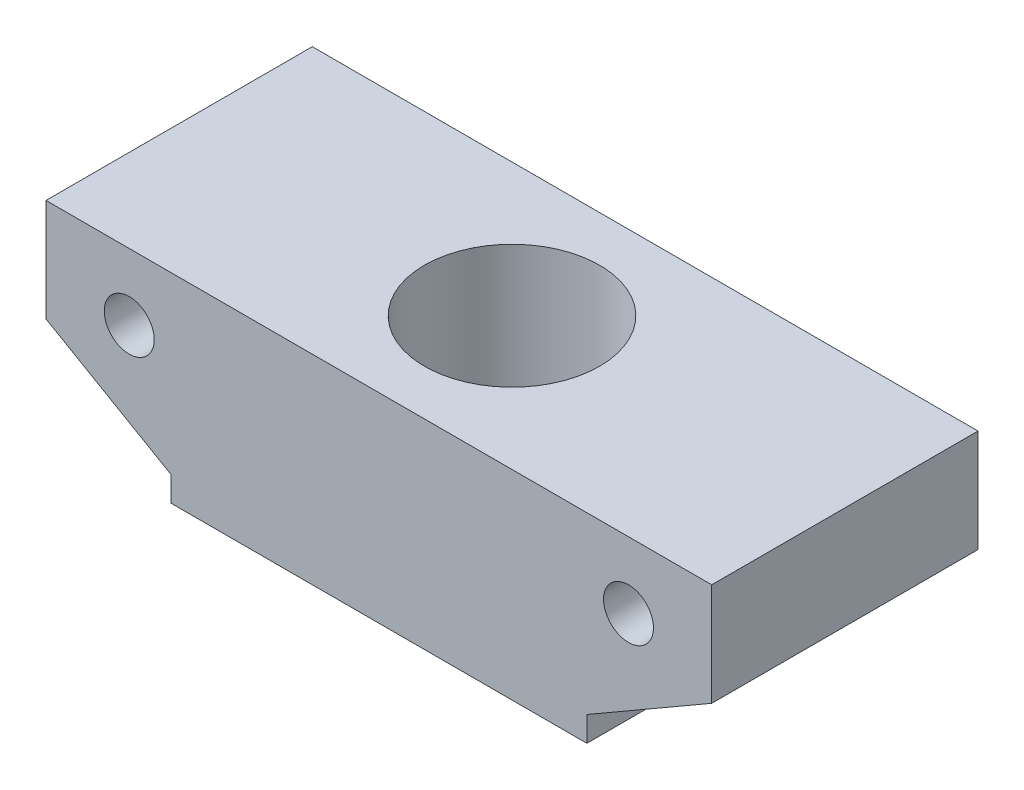
ISO-10303-21;
HEADER;
FILE_DESCRIPTION(('STEP AP214'),'2;1');
FILE_NAME('part.step','',(''),(''),'','','');
FILE_SCHEMA(('AUTOMOTIVE_DESIGN { 1 0 10303 214 1 1 1 1 }'));
ENDSEC;
DATA;
#1=APPLICATION_CONTEXT('core data for automotive mechanical design processes');
#2=APPLICATION_PROTOCOL_DEFINITION('international standard','automotive_design',2000,#1);
#3=PRODUCT_CONTEXT('',#1,'mechanical');
#4=PRODUCT('Part','Part','',(#3));
#5=PRODUCT_RELATED_PRODUCT_CATEGORY('part','',(#4));
#6=PRODUCT_DEFINITION_FORMATION('','',#4);
#7=PRODUCT_DEFINITION_CONTEXT('part definition',#1,'design');
#8=PRODUCT_DEFINITION('design','',#6,#7);
#9=PRODUCT_DEFINITION_SHAPE('','',#8);
#10=(LENGTH_UNIT() NAMED_UNIT(*) SI_UNIT(.MILLI.,.METRE.));
#11=(NAMED_UNIT(*) PLANE_ANGLE_UNIT() SI_UNIT($,.RADIAN.));
#12=(NAMED_UNIT(*) SI_UNIT($,.STERADIAN.) SOLID_ANGLE_UNIT());
#13=UNCERTAINTY_MEASURE_WITH_UNIT(LENGTH_MEASURE(1.E-05),#10,'distance_accuracy_value','');
#14=(GEOMETRIC_REPRESENTATION_CONTEXT(3) GLOBAL_UNCERTAINTY_ASSIGNED_CONTEXT((#13)) GLOBAL_UNIT_ASSIGNED_CONTEXT((#10,
#11,#12)) REPRESENTATION_CONTEXT('',''));
#15=CARTESIAN_POINT('',(0.,0.,0.));
#16=DIRECTION('',(0.,0.,1.));
#17=DIRECTION('',(1.,0.,0.));
#18=AXIS2_PLACEMENT_3D('',#15,#16,#17);
#19=CARTESIAN_POINT('',(12.5,12.,0.));
#20=DIRECTION('',(0.,0.,1.));
#21=DIRECTION('',(1.,0.,0.));
#22=AXIS2_PLACEMENT_3D('',#19,#20,#21);
#23=PLANE('',#22);
#24=CARTESIAN_POINT('',(15.,8.,0.));
#25=DIRECTION('',(0.,0.,-1.));
#26=DIRECTION('',(-1.,0.,0.));
#27=AXIS2_PLACEMENT_3D('',#24,#25,#26);
#28=CIRCLE('',#27,1.5);
#29=CARTESIAN_POINT('',(13.5,8.,0.));
#30=VERTEX_POINT('',#29);
#31=EDGE_CURVE('E226',#30,#30,#28,.T.);
#32=ORIENTED_EDGE('',*,*,#31,.F.);
#33=EDGE_LOOP('',(#32));
#34=FACE_BOUND('',#33,.T.);
#35=DIRECTION('',(0.,1.,0.));
#36=VECTOR('',#35,1.);
#37=CARTESIAN_POINT('',(12.5,0.,0.));
#38=LINE('',#37,#36);
#39=CARTESIAN_POINT('',(12.5,0.,0.));
#40=VERTEX_POINT('',#39);
#41=CARTESIAN_POINT('',(12.5,1.5,0.));
#42=VERTEX_POINT('',#41);
#43=EDGE_CURVE('E106',#40,#42,#38,.T.);
#44=ORIENTED_EDGE('',*,*,#43,.F.);
#45=DIRECTION('',(1.,0.,0.));
#46=VECTOR('',#45,1.);
#47=CARTESIAN_POINT('',(-12.5,0.,0.));
#48=LINE('',#47,#46);
#49=CARTESIAN_POINT('',(-12.5,0.,0.));
#50=VERTEX_POINT('',#49);
#51=EDGE_CURVE('E140',#50,#40,#48,.T.);
#52=ORIENTED_EDGE('',*,*,#51,.F.);
#53=DIRECTION('',(0.,1.,0.));
#54=VECTOR('',#53,1.);
#55=CARTESIAN_POINT('',(-12.5,0.,0.));
#56=LINE('',#55,#54);
#57=CARTESIAN_POINT('',(-12.5,1.5,0.));
#58=VERTEX_POINT('',#57);
#59=EDGE_CURVE('E137',#50,#58,#56,.T.);
#60=ORIENTED_EDGE('',*,*,#59,.T.);
#61=DIRECTION('',(-0.866025403784441,0.499999999999995,0.));
#62=VECTOR('',#61,1.);
#63=CARTESIAN_POINT('',(-12.5,1.5,0.));
#64=LINE('',#63,#62);
#65=CARTESIAN_POINT('',(-20.,5.83012701892213,0.));
#66=VERTEX_POINT('',#65);
#67=EDGE_CURVE('E134',#58,#66,#64,.T.);
#68=ORIENTED_EDGE('',*,*,#67,.T.);
#69=DIRECTION('',(0.,1.,0.));
#70=VECTOR('',#69,1.);
#71=CARTESIAN_POINT('',(-20.,5.83012701892213,0.));
#72=LINE('',#71,#70);
#73=CARTESIAN_POINT('',(-20.,12.,0.));
#74=VERTEX_POINT('',#73);
#75=EDGE_CURVE('E131',#66,#74,#72,.T.);
#76=ORIENTED_EDGE('',*,*,#75,.T.);
#77=DIRECTION('',(-1.,0.,0.));
#78=VECTOR('',#77,1.);
#79=CARTESIAN_POINT('',(20.,12.,0.));
#80=LINE('',#79,#78);
#81=CARTESIAN_POINT('',(20.,12.,0.));
#82=VERTEX_POINT('',#81);
#83=EDGE_CURVE('E128',#82,#74,#80,.T.);
#84=ORIENTED_EDGE('',*,*,#83,.F.);
#85=DIRECTION('',(0.,1.,0.));
#86=VECTOR('',#85,1.);
#87=CARTESIAN_POINT('',(20.,5.83012701892213,0.));
#88=LINE('',#87,#86);
#89=CARTESIAN_POINT('',(20.,5.83012701892213,0.));
#90=VERTEX_POINT('',#89);
#91=EDGE_CURVE('E108',#90,#82,#88,.T.);
#92=ORIENTED_EDGE('',*,*,#91,.F.);
#93=DIRECTION('',(0.866025403784442,0.499999999999995,0.));
#94=VECTOR('',#93,1.);
#95=CARTESIAN_POINT('',(12.5,1.5,0.));
#96=LINE('',#95,#94);
#97=EDGE_CURVE('E102',#42,#90,#96,.T.);
#98=ORIENTED_EDGE('',*,*,#97,.F.);
#99=EDGE_LOOP('',(#44,#52,#60,#68,#76,#84,#92,#98));
#100=FACE_BOUND('',#99,.T.);
#101=CARTESIAN_POINT('',(-15.,8.,0.));
#102=DIRECTION('',(0.,0.,-1.));
#103=DIRECTION('',(-1.,0.,0.));
#104=AXIS2_PLACEMENT_3D('',#101,#102,#103);
#105=CIRCLE('',#104,1.5);
#106=CARTESIAN_POINT('',(-16.5,8.,0.));
#107=VERTEX_POINT('',#106);
#108=EDGE_CURVE('E222',#107,#107,#105,.T.);
#109=ORIENTED_EDGE('',*,*,#108,.F.);
#110=EDGE_LOOP('',(#109));
#111=FACE_BOUND('',#110,.T.);
#112=ADVANCED_FACE('F35',(#34,#100,#111),#23,.F.);
#113=CARTESIAN_POINT('',(12.5,12.,16.));
#114=DIRECTION('',(0.,0.,1.));
#115=DIRECTION('',(1.,0.,0.));
#116=AXIS2_PLACEMENT_3D('',#113,#114,#115);
#117=PLANE('',#116);
#118=CARTESIAN_POINT('',(15.,8.,16.));
#119=DIRECTION('',(0.,0.,-1.));
#120=DIRECTION('',(-1.,0.,0.));
#121=AXIS2_PLACEMENT_3D('',#118,#119,#120);
#122=CIRCLE('',#121,1.5);
#123=CARTESIAN_POINT('',(13.5,8.,16.));
#124=VERTEX_POINT('',#123);
#125=EDGE_CURVE('E229',#124,#124,#122,.T.);
#126=ORIENTED_EDGE('',*,*,#125,.T.);
#127=EDGE_LOOP('',(#126));
#128=FACE_BOUND('',#127,.T.);
#129=DIRECTION('',(0.,1.,0.));
#130=VECTOR('',#129,1.);
#131=CARTESIAN_POINT('',(12.5,0.,16.));
#132=LINE('',#131,#130);
#133=CARTESIAN_POINT('',(12.5,0.,16.));
#134=VERTEX_POINT('',#133);
#135=CARTESIAN_POINT('',(12.5,1.5,16.));
#136=VERTEX_POINT('',#135);
#137=EDGE_CURVE('E142',#134,#136,#132,.T.);
#138=ORIENTED_EDGE('',*,*,#137,.T.);
#139=DIRECTION('',(0.866025403784442,0.499999999999995,0.));
#140=VECTOR('',#139,1.);
#141=CARTESIAN_POINT('',(12.5,1.5,16.));
#142=LINE('',#141,#140);
#143=CARTESIAN_POINT('',(20.,5.83012701892213,16.));
#144=VERTEX_POINT('',#143);
#145=EDGE_CURVE('E115',#136,#144,#142,.T.);
#146=ORIENTED_EDGE('',*,*,#145,.T.);
#147=DIRECTION('',(0.,1.,0.));
#148=VECTOR('',#147,1.);
#149=CARTESIAN_POINT('',(20.,5.83012701892213,16.));
#150=LINE('',#149,#148);
#151=CARTESIAN_POINT('',(20.,12.,16.));
#152=VERTEX_POINT('',#151);
#153=EDGE_CURVE('E145',#144,#152,#150,.T.);
#154=ORIENTED_EDGE('',*,*,#153,.T.);
#155=DIRECTION('',(-1.,0.,0.));
#156=VECTOR('',#155,1.);
#157=CARTESIAN_POINT('',(20.,12.,16.));
#158=LINE('',#157,#156);
#159=CARTESIAN_POINT('',(-20.,12.,16.));
#160=VERTEX_POINT('',#159);
#161=EDGE_CURVE('E147',#152,#160,#158,.T.);
#162=ORIENTED_EDGE('',*,*,#161,.T.);
#163=DIRECTION('',(0.,1.,0.));
#164=VECTOR('',#163,1.);
#165=CARTESIAN_POINT('',(-20.,5.83012701892213,16.));
#166=LINE('',#165,#164);
#167=CARTESIAN_POINT('',(-20.,5.83012701892213,16.));
#168=VERTEX_POINT('',#167);
#169=EDGE_CURVE('E149',#168,#160,#166,.T.);
#170=ORIENTED_EDGE('',*,*,#169,.F.);
#171=DIRECTION('',(-0.866025403784441,0.499999999999995,0.));
#172=VECTOR('',#171,1.);
#173=CARTESIAN_POINT('',(-12.5,1.5,16.));
#174=LINE('',#173,#172);
#175=CARTESIAN_POINT('',(-12.5,1.5,16.));
#176=VERTEX_POINT('',#175);
#177=EDGE_CURVE('E152',#176,#168,#174,.T.);
#178=ORIENTED_EDGE('',*,*,#177,.F.);
#179=DIRECTION('',(0.,1.,0.));
#180=VECTOR('',#179,1.);
#181=CARTESIAN_POINT('',(-12.5,0.,16.));
#182=LINE('',#181,#180);
#183=CARTESIAN_POINT('',(-12.5,0.,16.));
#184=VERTEX_POINT('',#183);
#185=EDGE_CURVE('E155',#184,#176,#182,.T.);
#186=ORIENTED_EDGE('',*,*,#185,.F.);
#187=DIRECTION('',(1.,0.,0.));
#188=VECTOR('',#187,1.);
#189=CARTESIAN_POINT('',(-12.5,0.,16.));
#190=LINE('',#189,#188);
#191=EDGE_CURVE('E50',#184,#134,#190,.T.);
#192=ORIENTED_EDGE('',*,*,#191,.T.);
#193=EDGE_LOOP('',(#138,#146,#154,#162,#170,#178,#186,#192));
#194=FACE_BOUND('',#193,.T.);
#195=CARTESIAN_POINT('',(-15.,8.,16.));
#196=DIRECTION('',(0.,0.,-1.));
#197=DIRECTION('',(-1.,0.,0.));
#198=AXIS2_PLACEMENT_3D('',#195,#196,#197);
#199=CIRCLE('',#198,1.5);
#200=CARTESIAN_POINT('',(-16.5,8.,16.));
#201=VERTEX_POINT('',#200);
#202=EDGE_CURVE('E225',#201,#201,#199,.T.);
#203=ORIENTED_EDGE('',*,*,#202,.T.);
#204=EDGE_LOOP('',(#203));
#205=FACE_BOUND('',#204,.T.);
#206=ADVANCED_FACE('F173',(#128,#194,#205),#117,.T.);
#207=CARTESIAN_POINT('',(12.5,0.,16.));
#208=DIRECTION('',(-1.,0.,0.));
#209=DIRECTION('',(0.,-1.,0.));
#210=AXIS2_PLACEMENT_3D('',#207,#208,#209);
#211=PLANE('',#210);
#212=ORIENTED_EDGE('',*,*,#43,.T.);
#213=DIRECTION('',(0.,0.,-1.));
#214=VECTOR('',#213,1.);
#215=CARTESIAN_POINT('',(12.5,1.5,16.));
#216=LINE('',#215,#214);
#217=EDGE_CURVE('E11',#136,#42,#216,.T.);
#218=ORIENTED_EDGE('',*,*,#217,.F.);
#219=ORIENTED_EDGE('',*,*,#137,.F.);
#220=DIRECTION('',(0.,0.,-1.));
#221=VECTOR('',#220,1.);
#222=CARTESIAN_POINT('',(12.5,0.,16.));
#223=LINE('',#222,#221);
#224=EDGE_CURVE('E119',#134,#40,#223,.T.);
#225=ORIENTED_EDGE('',*,*,#224,.T.);
#226=EDGE_LOOP('',(#212,#218,#219,#225));
#227=FACE_BOUND('',#226,.T.);
#228=ADVANCED_FACE('F37',(#227),#211,.F.);
#229=CARTESIAN_POINT('',(12.5,1.5,16.));
#230=DIRECTION('',(-0.499999999999995,0.866025403784442,0.));
#231=DIRECTION('',(-0.866025403784442,-0.499999999999995,0.));
#232=AXIS2_PLACEMENT_3D('',#229,#230,#231);
#233=PLANE('',#232);
#234=ORIENTED_EDGE('',*,*,#97,.T.);
#235=DIRECTION('',(0.,0.,-1.));
#236=VECTOR('',#235,1.);
#237=CARTESIAN_POINT('',(20.,5.83012701892213,16.));
#238=LINE('',#237,#236);
#239=EDGE_CURVE('E43',#144,#90,#238,.T.);
#240=ORIENTED_EDGE('',*,*,#239,.F.);
#241=ORIENTED_EDGE('',*,*,#145,.F.);
#242=ORIENTED_EDGE('',*,*,#217,.T.);
#243=EDGE_LOOP('',(#234,#240,#241,#242));
#244=FACE_BOUND('',#243,.T.);
#245=ADVANCED_FACE('F114',(#244),#233,.F.);
#246=CARTESIAN_POINT('',(20.,5.83012701892213,16.));
#247=DIRECTION('',(-1.,0.,0.));
#248=DIRECTION('',(0.,0.,1.));
#249=AXIS2_PLACEMENT_3D('',#246,#247,#248);
#250=PLANE('',#249);
#251=ORIENTED_EDGE('',*,*,#91,.T.);
#252=DIRECTION('',(0.,0.,-1.));
#253=VECTOR('',#252,1.);
#254=CARTESIAN_POINT('',(20.,12.,16.));
#255=LINE('',#254,#253);
#256=EDGE_CURVE('E166',#152,#82,#255,.T.);
#257=ORIENTED_EDGE('',*,*,#256,.F.);
#258=ORIENTED_EDGE('',*,*,#153,.F.);
#259=ORIENTED_EDGE('',*,*,#239,.T.);
#260=EDGE_LOOP('',(#251,#257,#258,#259));
#261=FACE_BOUND('',#260,.T.);
#262=ADVANCED_FACE('F170',(#261),#250,.F.);
#263=CARTESIAN_POINT('',(20.,12.,16.));
#264=DIRECTION('',(0.,-1.,0.));
#265=DIRECTION('',(1.,0.,0.));
#266=AXIS2_PLACEMENT_3D('',#263,#264,#265);
#267=PLANE('',#266);
#268=CARTESIAN_POINT('',(0.,12.,8.));
#269=DIRECTION('',(0.,1.,0.));
#270=DIRECTION('',(-1.,0.,0.));
#271=AXIS2_PLACEMENT_3D('',#268,#269,#270);
#272=CIRCLE('',#271,5.26210166543852);
#273=CARTESIAN_POINT('',(-5.26210166543852,12.,8.));
#274=VERTEX_POINT('',#273);
#275=EDGE_CURVE('E123',#274,#274,#272,.T.);
#276=ORIENTED_EDGE('',*,*,#275,.F.);
#277=EDGE_LOOP('',(#276));
#278=FACE_BOUND('',#277,.T.);
#279=ORIENTED_EDGE('',*,*,#83,.T.);
#280=DIRECTION('',(0.,0.,-1.));
#281=VECTOR('',#280,1.);
#282=CARTESIAN_POINT('',(-20.,12.,16.));
#283=LINE('',#282,#281);
#284=EDGE_CURVE('E164',#160,#74,#283,.T.);
#285=ORIENTED_EDGE('',*,*,#284,.F.);
#286=ORIENTED_EDGE('',*,*,#161,.F.);
#287=ORIENTED_EDGE('',*,*,#256,.T.);
#288=EDGE_LOOP('',(#279,#285,#286,#287));
#289=FACE_BOUND('',#288,.T.);
#290=ADVANCED_FACE('F179',(#278,#289),#267,.F.);
#291=CARTESIAN_POINT('',(-20.,5.83012701892213,16.));
#292=DIRECTION('',(-1.,0.,0.));
#293=DIRECTION('',(0.,0.,1.));
#294=AXIS2_PLACEMENT_3D('',#291,#292,#293);
#295=PLANE('',#294);
#296=ORIENTED_EDGE('',*,*,#75,.F.);
#297=DIRECTION('',(0.,0.,-1.));
#298=VECTOR('',#297,1.);
#299=CARTESIAN_POINT('',(-20.,5.83012701892213,16.));
#300=LINE('',#299,#298);
#301=EDGE_CURVE('E162',#168,#66,#300,.T.);
#302=ORIENTED_EDGE('',*,*,#301,.F.);
#303=ORIENTED_EDGE('',*,*,#169,.T.);
#304=ORIENTED_EDGE('',*,*,#284,.T.);
#305=EDGE_LOOP('',(#296,#302,#303,#304));
#306=FACE_BOUND('',#305,.T.);
#307=ADVANCED_FACE('F182',(#306),#295,.T.);
#308=CARTESIAN_POINT('',(-12.5,1.5,16.));
#309=DIRECTION('',(-0.499999999999995,-0.866025403784441,0.));
#310=DIRECTION('',(0.866025403784442,-0.499999999999995,0.));
#311=AXIS2_PLACEMENT_3D('',#308,#309,#310);
#312=PLANE('',#311);
#313=ORIENTED_EDGE('',*,*,#67,.F.);
#314=DIRECTION('',(0.,0.,-1.));
#315=VECTOR('',#314,1.);
#316=CARTESIAN_POINT('',(-12.5,1.5,16.));
#317=LINE('',#316,#315);
#318=EDGE_CURVE('E160',#176,#58,#317,.T.);
#319=ORIENTED_EDGE('',*,*,#318,.F.);
#320=ORIENTED_EDGE('',*,*,#177,.T.);
#321=ORIENTED_EDGE('',*,*,#301,.T.);
#322=EDGE_LOOP('',(#313,#319,#320,#321));
#323=FACE_BOUND('',#322,.T.);
#324=ADVANCED_FACE('F185',(#323),#312,.T.);
#325=CARTESIAN_POINT('',(-12.5,0.,16.));
#326=DIRECTION('',(-1.,0.,0.));
#327=DIRECTION('',(0.,-1.,0.));
#328=AXIS2_PLACEMENT_3D('',#325,#326,#327);
#329=PLANE('',#328);
#330=ORIENTED_EDGE('',*,*,#59,.F.);
#331=DIRECTION('',(0.,0.,-1.));
#332=VECTOR('',#331,1.);
#333=CARTESIAN_POINT('',(-12.5,0.,16.));
#334=LINE('',#333,#332);
#335=EDGE_CURVE('E58',#184,#50,#334,.T.);
#336=ORIENTED_EDGE('',*,*,#335,.F.);
#337=ORIENTED_EDGE('',*,*,#185,.T.);
#338=ORIENTED_EDGE('',*,*,#318,.T.);
#339=EDGE_LOOP('',(#330,#336,#337,#338));
#340=FACE_BOUND('',#339,.T.);
#341=ADVANCED_FACE('F186',(#340),#329,.T.);
#342=CARTESIAN_POINT('',(-12.5,0.,16.));
#343=DIRECTION('',(0.,1.,0.));
#344=DIRECTION('',(-1.,0.,0.));
#345=AXIS2_PLACEMENT_3D('',#342,#343,#344);
#346=PLANE('',#345);
#347=CARTESIAN_POINT('',(0.,0.,8.));
#348=DIRECTION('',(0.,1.,0.));
#349=DIRECTION('',(-1.,0.,0.));
#350=AXIS2_PLACEMENT_3D('',#347,#348,#349);
#351=CIRCLE('',#350,5.26210166543852);
#352=CARTESIAN_POINT('',(-5.26210166543852,0.,8.));
#353=VERTEX_POINT('',#352);
#354=EDGE_CURVE('E120',#353,#353,#351,.T.);
#355=ORIENTED_EDGE('',*,*,#354,.T.);
#356=EDGE_LOOP('',(#355));
#357=FACE_BOUND('',#356,.T.);
#358=ORIENTED_EDGE('',*,*,#51,.T.);
#359=ORIENTED_EDGE('',*,*,#224,.F.);
#360=ORIENTED_EDGE('',*,*,#191,.F.);
#361=ORIENTED_EDGE('',*,*,#335,.T.);
#362=EDGE_LOOP('',(#358,#359,#360,#361));
#363=FACE_BOUND('',#362,.T.);
#364=ADVANCED_FACE('F188',(#357,#363),#346,.F.);
#365=CARTESIAN_POINT('',(0.,0.,8.));
#366=DIRECTION('',(0.,1.,0.));
#367=DIRECTION('',(-1.,0.,0.));
#368=AXIS2_PLACEMENT_3D('',#365,#366,#367);
#369=CYLINDRICAL_SURFACE('',#368,5.26210166543852);
#370=ORIENTED_EDGE('',*,*,#354,.F.);
#371=EDGE_LOOP('',(#370));
#372=FACE_BOUND('',#371,.T.);
#373=ORIENTED_EDGE('',*,*,#275,.T.);
#374=EDGE_LOOP('',(#373));
#375=FACE_BOUND('',#374,.T.);
#376=ADVANCED_FACE('F190',(#372,#375),#369,.F.);
#377=CARTESIAN_POINT('',(15.,8.,0.));
#378=DIRECTION('',(0.,0.,-1.));
#379=DIRECTION('',(-1.,0.,0.));
#380=AXIS2_PLACEMENT_3D('',#377,#378,#379);
#381=CYLINDRICAL_SURFACE('',#380,1.5);
#382=ORIENTED_EDGE('',*,*,#31,.T.);
#383=EDGE_LOOP('',(#382));
#384=FACE_BOUND('',#383,.T.);
#385=ORIENTED_EDGE('',*,*,#125,.F.);
#386=EDGE_LOOP('',(#385));
#387=FACE_BOUND('',#386,.T.);
#388=ADVANCED_FACE('F197',(#384,#387),#381,.F.);
#389=CARTESIAN_POINT('',(-15.,8.,0.));
#390=DIRECTION('',(0.,0.,-1.));
#391=DIRECTION('',(-1.,0.,0.));
#392=AXIS2_PLACEMENT_3D('',#389,#390,#391);
#393=CYLINDRICAL_SURFACE('',#392,1.5);
#394=ORIENTED_EDGE('',*,*,#108,.T.);
#395=EDGE_LOOP('',(#394));
#396=FACE_BOUND('',#395,.T.);
#397=ORIENTED_EDGE('',*,*,#202,.F.);
#398=EDGE_LOOP('',(#397));
#399=FACE_BOUND('',#398,.T.);
#400=ADVANCED_FACE('F213',(#396,#399),#393,.F.);
#401=CLOSED_SHELL('',(#112,#206,#228,#245,#262,#290,#307,#324,#341,#364,#376,#388,#400));
#402=MANIFOLD_SOLID_BREP('B2',#401);
#403=ADVANCED_BREP_SHAPE_REPRESENTATION('',(#18,#402),#14);
#404=SHAPE_DEFINITION_REPRESENTATION(#9,#403);
ENDSEC;
END-ISO-10303-21;
